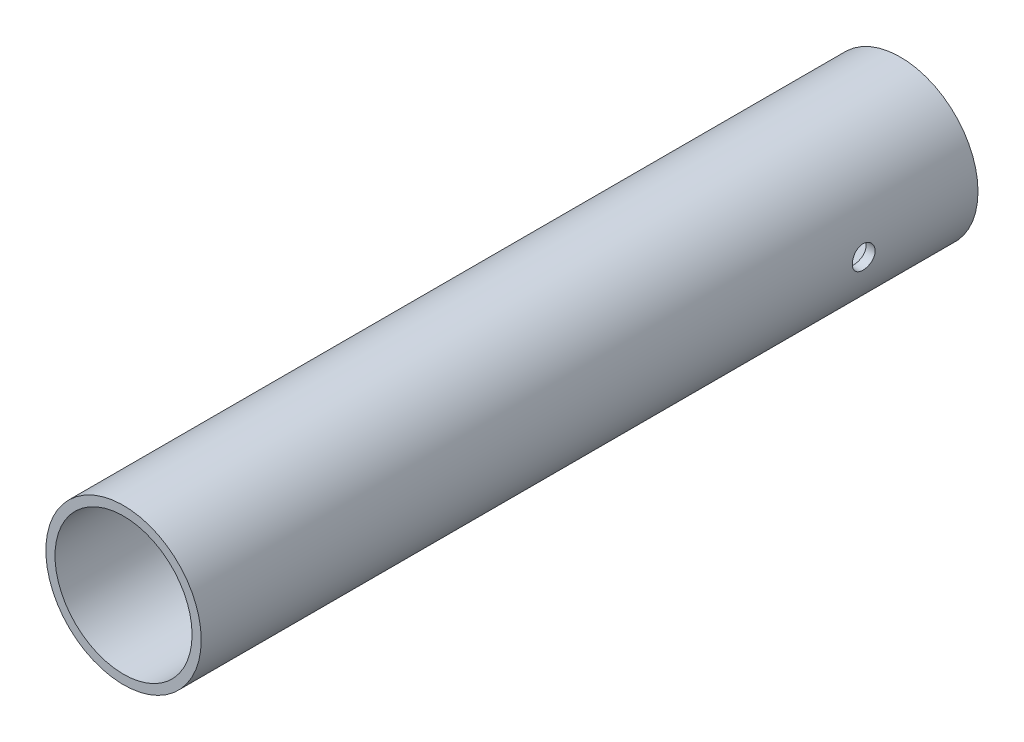
ISO-10303-21;
HEADER;
FILE_DESCRIPTION(('STEP AP214'),'2;1');
FILE_NAME('part.step','',(''),(''),'','','');
FILE_SCHEMA(('AUTOMOTIVE_DESIGN { 1 0 10303 214 1 1 1 1 }'));
ENDSEC;
DATA;
#1=APPLICATION_CONTEXT('core data for automotive mechanical design processes');
#2=APPLICATION_PROTOCOL_DEFINITION('international standard','automotive_design',2000,#1);
#3=PRODUCT_CONTEXT('',#1,'mechanical');
#4=PRODUCT('Part','Part','',(#3));
#5=PRODUCT_RELATED_PRODUCT_CATEGORY('part','',(#4));
#6=PRODUCT_DEFINITION_FORMATION('','',#4);
#7=PRODUCT_DEFINITION_CONTEXT('part definition',#1,'design');
#8=PRODUCT_DEFINITION('design','',#6,#7);
#9=PRODUCT_DEFINITION_SHAPE('','',#8);
#10=(LENGTH_UNIT() NAMED_UNIT(*) SI_UNIT(.MILLI.,.METRE.));
#11=(NAMED_UNIT(*) PLANE_ANGLE_UNIT() SI_UNIT($,.RADIAN.));
#12=(NAMED_UNIT(*) SI_UNIT($,.STERADIAN.) SOLID_ANGLE_UNIT());
#13=UNCERTAINTY_MEASURE_WITH_UNIT(LENGTH_MEASURE(1.E-05),#10,'distance_accuracy_value','');
#14=(GEOMETRIC_REPRESENTATION_CONTEXT(3) GLOBAL_UNCERTAINTY_ASSIGNED_CONTEXT((#13)) GLOBAL_UNIT_ASSIGNED_CONTEXT((#10,
#11,#12)) REPRESENTATION_CONTEXT('',''));
#15=CARTESIAN_POINT('',(0.,0.,0.));
#16=DIRECTION('',(0.,0.,1.));
#17=DIRECTION('',(1.,0.,0.));
#18=AXIS2_PLACEMENT_3D('',#15,#16,#17);
#19=CARTESIAN_POINT('',(0.,0.,85.));
#20=DIRECTION('',(0.,0.,-1.));
#21=DIRECTION('',(-1.,0.,0.));
#22=AXIS2_PLACEMENT_3D('',#19,#20,#21);
#23=CYLINDRICAL_SURFACE('',#22,15.);
#24=CARTESIAN_POINT('',(-15.,0.,-57.5));
#25=CARTESIAN_POINT('',(-14.9999976116882,-0.139390904958215,-57.5000055889478));
#26=CARTESIAN_POINT('',(-14.9980367791303,-0.278857881838822,-57.5116972749689));
#27=CARTESIAN_POINT('',(-14.9904034494139,-0.553880221673043,-57.5581356587653));
#28=CARTESIAN_POINT('',(-14.9847275392389,-0.689431867959246,-57.5929035569116));
#29=CARTESIAN_POINT('',(-14.9703006823645,-0.952604747212641,-57.6844154485928));
#30=CARTESIAN_POINT('',(-14.9615522515919,-1.0802323684319,-57.7411414656406));
#31=CARTESIAN_POINT('',(-14.9419422708207,-1.32414184197794,-57.8749122920524));
#32=CARTESIAN_POINT('',(-14.9310809625443,-1.44042498987859,-57.951954777483));
#33=CARTESIAN_POINT('',(-14.9083331745831,-1.65947261429168,-58.1249550838205));
#34=CARTESIAN_POINT('',(-14.8964387181486,-1.76211290353497,-58.2210691146361));
#35=CARTESIAN_POINT('',(-14.8730262687673,-1.94988849865992,-58.4291479684728));
#36=CARTESIAN_POINT('',(-14.8615082996267,-2.03502269939097,-58.5411137914566));
#37=CARTESIAN_POINT('',(-14.8400756575978,-2.18586712560513,-58.7785709661971));
#38=CARTESIAN_POINT('',(-14.8301712909164,-2.251454552861,-58.9041413368048));
#39=CARTESIAN_POINT('',(-14.8131978979467,-2.36055836541122,-59.1647095643006));
#40=CARTESIAN_POINT('',(-14.8061286801431,-2.40407624156561,-59.2997067836776));
#41=CARTESIAN_POINT('',(-14.7957053684276,-2.4674143777848,-59.5739802748565));
#42=CARTESIAN_POINT('',(-14.792317684857,-2.4874490291354,-59.7132057365014));
#43=CARTESIAN_POINT('',(-14.7895393893665,-2.50391672528987,-59.9930802768835));
#44=CARTESIAN_POINT('',(-14.7901484945721,-2.50035144038899,-60.1337292541673));
#45=CARTESIAN_POINT('',(-14.7952642886356,-2.46989509839615,-60.4109278612754));
#46=CARTESIAN_POINT('',(-14.7997307331892,-2.44324488188977,-60.5475048035452));
#47=CARTESIAN_POINT('',(-14.8119949521101,-2.36775314040344,-60.8142213178291));
#48=CARTESIAN_POINT('',(-14.8197928407327,-2.31891085431974,-60.9443606688885));
#49=CARTESIAN_POINT('',(-14.837884793341,-2.20017724609391,-61.1952288234409));
#50=CARTESIAN_POINT('',(-14.8481906710733,-2.13018591387971,-61.3159094060812));
#51=CARTESIAN_POINT('',(-14.8701291841501,-1.97121201755743,-61.5439044005384));
#52=CARTESIAN_POINT('',(-14.8817619265429,-1.88222792065429,-61.6512177324549));
#53=CARTESIAN_POINT('',(-14.9052202787979,-1.68648221215905,-61.8508260858073));
#54=CARTESIAN_POINT('',(-14.9170464923165,-1.57951396387313,-61.9429185185401));
#55=CARTESIAN_POINT('',(-14.9394260139672,-1.35153524898164,-62.1078777626653));
#56=CARTESIAN_POINT('',(-14.9499793138975,-1.23052469190642,-62.1807444501832));
#57=CARTESIAN_POINT('',(-14.9686389289291,-0.977705916166708,-62.3052022271363));
#58=CARTESIAN_POINT('',(-14.9767431840745,-0.845888725564658,-62.3567754193313));
#59=CARTESIAN_POINT('',(-14.9895750301266,-0.575298345602729,-62.436994215246));
#60=CARTESIAN_POINT('',(-14.9943029035047,-0.436525739179466,-62.4656417369737));
#61=CARTESIAN_POINT('',(-14.9998112984269,-0.157709901301623,-62.4989213584611));
#62=CARTESIAN_POINT('',(-15.0006375301278,-0.0177007371510112,-62.5038315718056));
#63=CARTESIAN_POINT('',(-14.9983747442117,0.261139772889886,-62.4902386555719));
#64=CARTESIAN_POINT('',(-14.9952858772412,0.399971163892037,-62.4717364268663));
#65=CARTESIAN_POINT('',(-14.985568269382,0.67165617554676,-62.4120751506645));
#66=CARTESIAN_POINT('',(-14.9789610480131,0.804540868385375,-62.3710537916099));
#67=CARTESIAN_POINT('',(-14.9629446445536,1.06154688486044,-62.2676654818005));
#68=CARTESIAN_POINT('',(-14.9535353051202,1.18566771590972,-62.2052973323647));
#69=CARTESIAN_POINT('',(-14.9328451630241,1.42283068946895,-62.0603488753032));
#70=CARTESIAN_POINT('',(-14.9215485588702,1.53576525093714,-61.9775948438327));
#71=CARTESIAN_POINT('',(-14.898384673919,1.74624358550268,-61.7944626846149));
#72=CARTESIAN_POINT('',(-14.8865173517155,1.84378623969658,-61.6940832767233));
#73=CARTESIAN_POINT('',(-14.8634017523585,2.021742779658,-61.4773024519286));
#74=CARTESIAN_POINT('',(-14.8521611613711,2.10196876111371,-61.3607458344856));
#75=CARTESIAN_POINT('',(-14.8317152977788,2.24170231029498,-61.1156470308615));
#76=CARTESIAN_POINT('',(-14.8225099606602,2.30121053476982,-60.9871052247725));
#77=CARTESIAN_POINT('',(-14.807234536977,2.39753833147315,-60.7222102671879));
#78=CARTESIAN_POINT('',(-14.8011515431106,2.43445143254794,-60.5858919049695));
#79=CARTESIAN_POINT('',(-14.7927771683526,2.48483545377827,-60.3088798707782));
#80=CARTESIAN_POINT('',(-14.7904854578272,2.49830841194616,-60.1681865802679));
#81=CARTESIAN_POINT('',(-14.7899673308401,2.50137286604735,-59.8882948340376));
#82=CARTESIAN_POINT('',(-14.7916905650565,2.49126013612518,-59.7490996214247));
#83=CARTESIAN_POINT('',(-14.7988978145373,2.44807983895684,-59.4744207519492));
#84=CARTESIAN_POINT('',(-14.8043818176121,2.41501234611247,-59.3389370830581));
#85=CARTESIAN_POINT('',(-14.8184735628172,2.3269744895949,-59.0756415627074));
#86=CARTESIAN_POINT('',(-14.8270776721967,2.27202959060044,-58.947820989944));
#87=CARTESIAN_POINT('',(-14.8464436892221,2.1418270039159,-58.7031643308052));
#88=CARTESIAN_POINT('',(-14.857205703884,2.06656830874856,-58.5863287896279));
#89=CARTESIAN_POINT('',(-14.8798345404562,1.89681888437215,-58.3654644168922));
#90=CARTESIAN_POINT('',(-14.891712955763,1.80211056359364,-58.2616039832997));
#91=CARTESIAN_POINT('',(-14.9151437236084,1.59660903138023,-58.0711483955251));
#92=CARTESIAN_POINT('',(-14.9266960002655,1.48581211291263,-57.9845572313618));
#93=CARTESIAN_POINT('',(-14.9482652964222,1.25036916964028,-57.8305517318001));
#94=CARTESIAN_POINT('',(-14.958271162531,1.12563278753282,-57.7632739606871));
#95=CARTESIAN_POINT('',(-14.9755116760178,0.866513069378979,-57.6507305153901));
#96=CARTESIAN_POINT('',(-14.9827490817748,0.732139494830007,-57.6054429189203));
#97=CARTESIAN_POINT('',(-14.9920579083296,0.497703310045398,-57.5479947258733));
#98=CARTESIAN_POINT('',(-14.9950202727336,0.399058830298446,-57.530025530384));
#99=CARTESIAN_POINT('',(-14.9989921598612,0.200289310319809,-57.5060262621553));
#100=CARTESIAN_POINT('',(-15.0000017162064,0.100164295608494,-57.4999959838627));
#101=CARTESIAN_POINT('',(-15.,0.,-57.5));
#102=B_SPLINE_CURVE_WITH_KNOTS('',3,(#24,#25,#26,#27,#28,#29,#30,#31,#32,#33,#34,#35,#36,#37,
#38,#39,#40,#41,#42,#43,#44,#45,#46,#47,#48,#49,#50,#51,#52,#53,#54,#55,#56,#57,#58,#59,#60,#61,
#62,#63,#64,#65,#66,#67,#68,#69,#70,#71,#72,#73,#74,#75,#76,#77,#78,#79,#80,#81,#82,#83,#84,#85,
#86,#87,#88,#89,#90,#91,#92,#93,#94,#95,#96,#97,#98,#99,#100,#101),.UNSPECIFIED.,.T.,.F.,(4,2,2,
2,2,2,2,2,2,2,2,2,2,2,2,2,2,2,2,2,2,2,2,2,2,2,2,2,2,2,2,2,2,2,2,2,2,2,4),(0.,0.41780658493851,
0.835997545695417,1.25384686702526,1.67164841267479,2.09302491062332,2.51442800169856,
2.9384252082384,3.36239376876181,3.78246077103422,4.20249804320885,4.61820521760408,
5.0339266502538,5.45164556632557,5.86939820680572,6.29232769911325,6.71525991635846,
7.13854688915902,7.56179844521147,7.98007883491395,8.39834313035858,8.81407807006413,
9.22983635826064,9.64926825627021,10.0687306305428,10.4925382200762,10.9163323737594,
11.3383602234177,11.7603513778661,12.177079095227,12.5938054618813,13.0100481822622,
13.4263115502933,13.8475138419339,14.2688133387897,14.693022316072,15.1168075213007,
15.4170424816401,15.7172722727696),.UNSPECIFIED.);
#103=CARTESIAN_POINT('',(-15.,0.,-57.5));
#104=VERTEX_POINT('',#103);
#105=EDGE_CURVE('E80',#104,#104,#102,.T.);
#106=ORIENTED_EDGE('',*,*,#105,.F.);
#107=EDGE_LOOP('',(#106));
#108=FACE_BOUND('',#107,.T.);
#109=CARTESIAN_POINT('',(15.,0.,-62.5));
#110=CARTESIAN_POINT('',(14.9999976116882,-0.139390904958214,-62.4999944110522));
#111=CARTESIAN_POINT('',(14.9980367791303,-0.27885788183882,-62.4883027250311));
#112=CARTESIAN_POINT('',(14.9904034494139,-0.553880221673041,-62.4418643412347));
#113=CARTESIAN_POINT('',(14.9847275392389,-0.689431867959245,-62.4070964430884));
#114=CARTESIAN_POINT('',(14.9703006823645,-0.952604747212642,-62.3155845514072));
#115=CARTESIAN_POINT('',(14.9615522515919,-1.0802323684319,-62.2588585343594));
#116=CARTESIAN_POINT('',(14.9419422708207,-1.32414184197794,-62.1250877079476));
#117=CARTESIAN_POINT('',(14.9310809625443,-1.44042498987859,-62.048045222517));
#118=CARTESIAN_POINT('',(14.9083331745831,-1.65947261429168,-61.8750449161795));
#119=CARTESIAN_POINT('',(14.8964387181486,-1.76211290353497,-61.7789308853639));
#120=CARTESIAN_POINT('',(14.8730262687673,-1.94988849865992,-61.5708520315272));
#121=CARTESIAN_POINT('',(14.8615082996267,-2.03502269939097,-61.4588862085434));
#122=CARTESIAN_POINT('',(14.8400756575978,-2.18586712560513,-61.2214290338029));
#123=CARTESIAN_POINT('',(14.8301712909164,-2.251454552861,-61.0958586631952));
#124=CARTESIAN_POINT('',(14.8131978979467,-2.36055836541122,-60.8352904356994));
#125=CARTESIAN_POINT('',(14.8061286801431,-2.40407624156561,-60.7002932163224));
#126=CARTESIAN_POINT('',(14.7957053684276,-2.4674143777848,-60.4260197251435));
#127=CARTESIAN_POINT('',(14.792317684857,-2.4874490291354,-60.2867942634986));
#128=CARTESIAN_POINT('',(14.7895393893665,-2.50391672528987,-60.0069197231165));
#129=CARTESIAN_POINT('',(14.7901484945721,-2.50035144038899,-59.8662707458327));
#130=CARTESIAN_POINT('',(14.7952642886356,-2.46989509839615,-59.5890721387245));
#131=CARTESIAN_POINT('',(14.7997307331892,-2.44324488188977,-59.4524951964548));
#132=CARTESIAN_POINT('',(14.8119949521101,-2.36775314040344,-59.1857786821709));
#133=CARTESIAN_POINT('',(14.8197928407327,-2.31891085431973,-59.0556393311115));
#134=CARTESIAN_POINT('',(14.837884793341,-2.20017724609391,-58.8047711765591));
#135=CARTESIAN_POINT('',(14.8481906710733,-2.13018591387971,-58.6840905939188));
#136=CARTESIAN_POINT('',(14.8701291841501,-1.97121201755743,-58.4560955994616));
#137=CARTESIAN_POINT('',(14.8817619265429,-1.88222792065429,-58.3487822675451));
#138=CARTESIAN_POINT('',(14.9052202787979,-1.68648221215905,-58.1491739141927));
#139=CARTESIAN_POINT('',(14.9170464923165,-1.57951396387313,-58.0570814814599));
#140=CARTESIAN_POINT('',(14.9394260139672,-1.35153524898164,-57.8921222373347));
#141=CARTESIAN_POINT('',(14.9499793138975,-1.23052469190642,-57.8192555498168));
#142=CARTESIAN_POINT('',(14.9686389289291,-0.977705916166709,-57.6947977728637));
#143=CARTESIAN_POINT('',(14.9767431840745,-0.845888725564659,-57.6432245806687));
#144=CARTESIAN_POINT('',(14.9895750301266,-0.575298345602731,-57.563005784754));
#145=CARTESIAN_POINT('',(14.9943029035047,-0.436525739179468,-57.5343582630263));
#146=CARTESIAN_POINT('',(14.9998112984269,-0.157709901301625,-57.5010786415389));
#147=CARTESIAN_POINT('',(15.0006375301278,-0.017700737151012,-57.4961684281944));
#148=CARTESIAN_POINT('',(14.9983747442117,0.261139772889886,-57.5097613444281));
#149=CARTESIAN_POINT('',(14.9952858772412,0.399971163892038,-57.5282635731337));
#150=CARTESIAN_POINT('',(14.985568269382,0.671656175546761,-57.5879248493355));
#151=CARTESIAN_POINT('',(14.9789610480131,0.804540868385376,-57.6289462083901));
#152=CARTESIAN_POINT('',(14.9629446445536,1.06154688486044,-57.7323345181995));
#153=CARTESIAN_POINT('',(14.9535353051202,1.18566771590972,-57.7947026676353));
#154=CARTESIAN_POINT('',(14.9328451630241,1.42283068946895,-57.9396511246968));
#155=CARTESIAN_POINT('',(14.9215485588702,1.53576525093714,-58.0224051561673));
#156=CARTESIAN_POINT('',(14.898384673919,1.74624358550268,-58.2055373153851));
#157=CARTESIAN_POINT('',(14.8865173517155,1.84378623969658,-58.3059167232767));
#158=CARTESIAN_POINT('',(14.8634017523585,2.021742779658,-58.5226975480714));
#159=CARTESIAN_POINT('',(14.8521611613711,2.10196876111371,-58.6392541655144));
#160=CARTESIAN_POINT('',(14.8317152977788,2.24170231029498,-58.8843529691385));
#161=CARTESIAN_POINT('',(14.8225099606602,2.30121053476982,-59.0128947752275));
#162=CARTESIAN_POINT('',(14.807234536977,2.39753833147315,-59.2777897328121));
#163=CARTESIAN_POINT('',(14.8011515431106,2.43445143254794,-59.4141080950305));
#164=CARTESIAN_POINT('',(14.7927771683526,2.48483545377827,-59.6911201292218));
#165=CARTESIAN_POINT('',(14.7904854578272,2.49830841194616,-59.8318134197321));
#166=CARTESIAN_POINT('',(14.7899673308401,2.50137286604735,-60.1117051659624));
#167=CARTESIAN_POINT('',(14.7916905650565,2.49126013612518,-60.2509003785753));
#168=CARTESIAN_POINT('',(14.7988978145373,2.44807983895684,-60.5255792480508));
#169=CARTESIAN_POINT('',(14.8043818176121,2.41501234611247,-60.6610629169419));
#170=CARTESIAN_POINT('',(14.8184735628172,2.3269744895949,-60.9243584372926));
#171=CARTESIAN_POINT('',(14.8270776721967,2.27202959060044,-61.052179010056));
#172=CARTESIAN_POINT('',(14.8464436892221,2.1418270039159,-61.2968356691948));
#173=CARTESIAN_POINT('',(14.857205703884,2.06656830874856,-61.4136712103721));
#174=CARTESIAN_POINT('',(14.8798345404562,1.89681888437215,-61.6345355831078));
#175=CARTESIAN_POINT('',(14.891712955763,1.80211056359364,-61.7383960167003));
#176=CARTESIAN_POINT('',(14.9151437236084,1.59660903138023,-61.9288516044749));
#177=CARTESIAN_POINT('',(14.9266960002655,1.48581211291263,-62.0154427686382));
#178=CARTESIAN_POINT('',(14.9482652964222,1.25036916964028,-62.1694482681999));
#179=CARTESIAN_POINT('',(14.958271162531,1.12563278753282,-62.2367260393129));
#180=CARTESIAN_POINT('',(14.9755116760178,0.866513069378978,-62.3492694846099));
#181=CARTESIAN_POINT('',(14.9827490817748,0.732139494830007,-62.3945570810797));
#182=CARTESIAN_POINT('',(14.9920579083296,0.497703310045398,-62.4520052741267));
#183=CARTESIAN_POINT('',(14.9950202727336,0.399058830298445,-62.469974469616));
#184=CARTESIAN_POINT('',(14.9989921598612,0.200289310319808,-62.4939737378447));
#185=CARTESIAN_POINT('',(15.0000017162064,0.100164295608494,-62.5000040161374));
#186=CARTESIAN_POINT('',(15.,0.,-62.5));
#187=B_SPLINE_CURVE_WITH_KNOTS('',3,(#109,#110,#111,#112,#113,#114,#115,#116,#117,#118,#119,
#120,#121,#122,#123,#124,#125,#126,#127,#128,#129,#130,#131,#132,#133,#134,#135,#136,#137,#138,
#139,#140,#141,#142,#143,#144,#145,#146,#147,#148,#149,#150,#151,#152,#153,#154,#155,#156,#157,
#158,#159,#160,#161,#162,#163,#164,#165,#166,#167,#168,#169,#170,#171,#172,#173,#174,#175,#176,
#177,#178,#179,#180,#181,#182,#183,#184,#185,#186),.UNSPECIFIED.,.T.,.F.,(4,2,2,2,2,2,2,2,2,2,2,
2,2,2,2,2,2,2,2,2,2,2,2,2,2,2,2,2,2,2,2,2,2,2,2,2,2,2,4),(0.,0.417806584938508,
0.835997545695418,1.25384686702527,1.67164841267479,2.09302491062332,2.51442800169856,
2.9384252082384,3.36239376876181,3.78246077103423,4.20249804320886,4.61820521760409,
5.0339266502538,5.45164556632557,5.86939820680572,6.29232769911325,6.71525991635846,
7.13854688915902,7.56179844521147,7.98007883491396,8.39834313035858,8.81407807006414,
9.22983635826064,9.64926825627022,10.0687306305428,10.4925382200762,10.9163323737594,
11.3383602234177,11.7603513778662,12.177079095227,12.5938054618813,13.0100481822622,
13.4263115502933,13.8475138419339,14.2688133387897,14.693022316072,15.1168075213007,
15.4170424816401,15.7172722727696),.UNSPECIFIED.);
#188=CARTESIAN_POINT('',(15.,0.,-62.5));
#189=VERTEX_POINT('',#188);
#190=EDGE_CURVE('E75',#189,#189,#187,.T.);
#191=ORIENTED_EDGE('',*,*,#190,.F.);
#192=EDGE_LOOP('',(#191));
#193=FACE_BOUND('',#192,.T.);
#194=CARTESIAN_POINT('',(0.,0.,85.));
#195=DIRECTION('',(0.,0.,1.));
#196=DIRECTION('',(1.,0.,0.));
#197=AXIS2_PLACEMENT_3D('',#194,#195,#196);
#198=CIRCLE('',#197,15.);
#199=CARTESIAN_POINT('',(15.,0.,85.));
#200=VERTEX_POINT('',#199);
#201=EDGE_CURVE('E52',#200,#200,#198,.T.);
#202=ORIENTED_EDGE('',*,*,#201,.T.);
#203=EDGE_LOOP('',(#202));
#204=FACE_BOUND('',#203,.T.);
#205=CARTESIAN_POINT('',(0.,0.,-85.));
#206=DIRECTION('',(0.,0.,1.));
#207=DIRECTION('',(1.,0.,0.));
#208=AXIS2_PLACEMENT_3D('',#205,#206,#207);
#209=CIRCLE('',#208,15.);
#210=CARTESIAN_POINT('',(15.,0.,-85.));
#211=VERTEX_POINT('',#210);
#212=EDGE_CURVE('E86',#211,#211,#209,.T.);
#213=ORIENTED_EDGE('',*,*,#212,.F.);
#214=EDGE_LOOP('',(#213));
#215=FACE_BOUND('',#214,.T.);
#216=ADVANCED_FACE('F33',(#108,#193,#204,#215),#23,.F.);
#217=CARTESIAN_POINT('',(0.,0.,85.));
#218=DIRECTION('',(0.,0.,-1.));
#219=DIRECTION('',(-1.,0.,0.));
#220=AXIS2_PLACEMENT_3D('',#217,#218,#219);
#221=CYLINDRICAL_SURFACE('',#220,17.);
#222=CARTESIAN_POINT('',(-17.,0.,-62.5));
#223=CARTESIAN_POINT('',(-16.999997793131,0.139618263933643,-62.4999942181081));
#224=CARTESIAN_POINT('',(-16.9982619631343,0.279318334742721,-62.4882645651211));
#225=CARTESIAN_POINT('',(-16.9915044414465,0.554815864347193,-62.4416664885911));
#226=CARTESIAN_POINT('',(-16.9864795210156,0.690609351356016,-62.4067753280472));
#227=CARTESIAN_POINT('',(-16.9737086836159,0.954266664820787,-62.3149174733872));
#228=CARTESIAN_POINT('',(-16.9659647952965,1.08213631987448,-62.2579672345128));
#229=CARTESIAN_POINT('',(-16.9486124241397,1.3264840365203,-62.1236475337935));
#230=CARTESIAN_POINT('',(-16.9390042079744,1.44296372374599,-62.0462809917132));
#231=CARTESIAN_POINT('',(-16.9189113868221,1.66212119979329,-61.8727046523535));
#232=CARTESIAN_POINT('',(-16.9084213236713,1.76470092382525,-61.7763716572785));
#233=CARTESIAN_POINT('',(-16.887789985922,1.95230070871523,-61.5678620163514));
#234=CARTESIAN_POINT('',(-16.8776487311065,2.03731977497712,-61.4556844737053));
#235=CARTESIAN_POINT('',(-16.8588102121396,2.18776463859896,-61.2180137363662));
#236=CARTESIAN_POINT('',(-16.8501200004422,2.25309591742831,-61.0924601042765));
#237=CARTESIAN_POINT('',(-16.8352417558288,2.36170671911328,-60.8320129732306));
#238=CARTESIAN_POINT('',(-16.8290535918791,2.40498739680278,-60.6971199638164));
#239=CARTESIAN_POINT('',(-16.819933589302,2.46796464304165,-60.4228530062869));
#240=CARTESIAN_POINT('',(-16.8169786171038,2.4878288374678,-60.2835183316785));
#241=CARTESIAN_POINT('',(-16.8145892786749,2.50392846030981,-60.003464386118));
#242=CARTESIAN_POINT('',(-16.8151547180392,2.50016519348746,-59.8627451920508));
#243=CARTESIAN_POINT('',(-16.8197211578168,2.46925378270774,-59.5850988051509));
#244=CARTESIAN_POINT('',(-16.8236947679923,2.44229207080976,-59.4481503408737));
#245=CARTESIAN_POINT('',(-16.8345870467401,2.36604083270517,-59.1807425557001));
#246=CARTESIAN_POINT('',(-16.8415057956586,2.31675069735604,-59.050283411947));
#247=CARTESIAN_POINT('',(-16.857539142223,2.19704705914093,-58.7989887816149));
#248=CARTESIAN_POINT('',(-16.8666619500121,2.12655433007143,-58.678191579542));
#249=CARTESIAN_POINT('',(-16.8860695216999,1.96650298810832,-58.4500699591038));
#250=CARTESIAN_POINT('',(-16.8963543589216,1.87694317178514,-58.3427463918144));
#251=CARTESIAN_POINT('',(-16.9170482652418,1.6802753243751,-58.1435378637112));
#252=CARTESIAN_POINT('',(-16.9274575785055,1.57300695254414,-58.0518111500901));
#253=CARTESIAN_POINT('',(-16.9471357134677,1.34451413749425,-57.887638309751));
#254=CARTESIAN_POINT('',(-16.9564045305161,1.22328963737823,-57.8151922616415));
#255=CARTESIAN_POINT('',(-16.9727664753804,0.970190436846701,-57.6916301135368));
#256=CARTESIAN_POINT('',(-16.9798583870044,0.838309834869857,-57.6405259310717));
#257=CARTESIAN_POINT('',(-16.991057196357,0.567710944898677,-57.5612342283985));
#258=CARTESIAN_POINT('',(-16.9951642879764,0.428993101669629,-57.5330452196304));
#259=CARTESIAN_POINT('',(-16.9999050818336,0.150023519282231,-57.5005937968128));
#260=CARTESIAN_POINT('',(-17.0005703732726,0.00979761097236659,-57.4961137704723));
#261=CARTESIAN_POINT('',(-16.9984385067869,-0.269403415413674,-57.5106302951339));
#262=CARTESIAN_POINT('',(-16.9956414517703,-0.40837857054114,-57.5296261483847));
#263=CARTESIAN_POINT('',(-16.9869187192332,-0.68047610442486,-57.5903742721309));
#264=CARTESIAN_POINT('',(-16.9810075822558,-0.813622595189715,-57.6320208091092));
#265=CARTESIAN_POINT('',(-16.9667174597167,-1.07104301967473,-57.7367768070214));
#266=CARTESIAN_POINT('',(-16.9583383621802,-1.19531655049811,-57.7998872418232));
#267=CARTESIAN_POINT('',(-16.9399652839742,-1.43242218615396,-57.94629211294));
#268=CARTESIAN_POINT('',(-16.9299603948874,-1.54516798121673,-58.0297249357443));
#269=CARTESIAN_POINT('',(-16.9094840590999,-1.75513489222198,-58.2142131712884));
#270=CARTESIAN_POINT('',(-16.8990125864157,-1.85235514217673,-58.3152695663831));
#271=CARTESIAN_POINT('',(-16.8786834541762,-2.02930056628108,-58.5331038420833));
#272=CARTESIAN_POINT('',(-16.8688313544641,-2.10888006584901,-58.6500006506408));
#273=CARTESIAN_POINT('',(-16.8509540599789,-2.24727323997785,-58.8956301073293));
#274=CARTESIAN_POINT('',(-16.8429288173692,-2.30608745830279,-59.0243624454214));
#275=CARTESIAN_POINT('',(-16.8296538581595,-2.40105348668988,-59.2895698311896));
#276=CARTESIAN_POINT('',(-16.8243946779348,-2.43728264767766,-59.4260166863741));
#277=CARTESIAN_POINT('',(-16.8172219020188,-2.48629673443478,-59.7031411531762));
#278=CARTESIAN_POINT('',(-16.815308085025,-2.49908321098619,-59.8438184843133));
#279=CARTESIAN_POINT('',(-16.8150507670265,-2.50081314025997,-60.1239589898984));
#280=CARTESIAN_POINT('',(-16.8166729719777,-2.4899856124276,-60.2634207727804));
#281=CARTESIAN_POINT('',(-16.8232304869987,-2.4452849279886,-60.5385173126761));
#282=CARTESIAN_POINT('',(-16.8281657925681,-2.41141180268506,-60.6741520748879));
#283=CARTESIAN_POINT('',(-16.8407816094163,-2.32166128628093,-60.9376851195551));
#284=CARTESIAN_POINT('',(-16.8484602009356,-2.265799280287,-61.065588739286));
#285=CARTESIAN_POINT('',(-16.8656998369544,-2.13367943489691,-61.3102452268788));
#286=CARTESIAN_POINT('',(-16.8752609401864,-2.05742095912403,-61.4269977466683));
#287=CARTESIAN_POINT('',(-16.8952988011725,-1.88583847980749,-61.6472024177831));
#288=CARTESIAN_POINT('',(-16.9057832085905,-1.79034469442663,-61.7505215943461));
#289=CARTESIAN_POINT('',(-16.92642201351,-1.58336095356046,-61.9397507805396));
#290=CARTESIAN_POINT('',(-16.9365763336202,-1.47186727949618,-62.0256567318852));
#291=CARTESIAN_POINT('',(-16.9554718925697,-1.23535773881122,-62.1780241917968));
#292=CARTESIAN_POINT('',(-16.9642053874589,-1.11027358494527,-62.2443806415313));
#293=CARTESIAN_POINT('',(-16.9791991247469,-0.850667584310127,-62.3550443003182));
#294=CARTESIAN_POINT('',(-16.9854619433621,-0.716155741284793,-62.3993744891167));
#295=CARTESIAN_POINT('',(-16.9933688461727,-0.484190218187675,-62.4545995293981));
#296=CARTESIAN_POINT('',(-16.9958428419025,-0.388172624228652,-62.4715988867554));
#297=CARTESIAN_POINT('',(-16.9991591791261,-0.194783283695077,-62.4943010729119));
#298=CARTESIAN_POINT('',(-17.0000015397308,-0.0974115529944626,-62.5000040340214));
#299=CARTESIAN_POINT('',(-17.,0.,-62.5));
#300=B_SPLINE_CURVE_WITH_KNOTS('',3,(#222,#223,#224,#225,#226,#227,#228,#229,#230,#231,#232,
#233,#234,#235,#236,#237,#238,#239,#240,#241,#242,#243,#244,#245,#246,#247,#248,#249,#250,#251,
#252,#253,#254,#255,#256,#257,#258,#259,#260,#261,#262,#263,#264,#265,#266,#267,#268,#269,#270,
#271,#272,#273,#274,#275,#276,#277,#278,#279,#280,#281,#282,#283,#284,#285,#286,#287,#288,#289,
#290,#291,#292,#293,#294,#295,#296,#297,#298,#299),.UNSPECIFIED.,.T.,.F.,(4,2,2,2,2,2,2,2,2,2,2,
2,2,2,2,2,2,2,2,2,2,2,2,2,2,2,2,2,2,2,2,2,2,2,2,2,2,2,4),(0.,0.418498857511902,
0.837409152330178,1.25600755579683,1.67454612732146,2.09589880308584,2.51727533677713,
2.94064374704005,3.3639899823766,3.78428694551124,4.2045606991021,4.6214881774743,
5.03842703074502,5.45694360373011,5.87548659945091,6.29805109091572,6.72061730517517,
7.14341917050652,7.56619356861205,7.98508072630456,8.40395543411029,8.82089140788562,
9.23784630155636,9.65772400348282,10.0776251172785,10.5008742387869,10.9241122761825,
11.3458926970847,11.7676452153327,12.1853255880243,12.6030053933771,13.0203934758991,
13.4377945825891,13.8590554809119,14.2804144447029,14.7039981269519,15.1271389563846,
15.4191287002785,15.7111150241882),.UNSPECIFIED.);
#301=CARTESIAN_POINT('',(-17.,0.,-62.5));
#302=VERTEX_POINT('',#301);
#303=EDGE_CURVE('E10',#302,#302,#300,.T.);
#304=ORIENTED_EDGE('',*,*,#303,.T.);
#305=EDGE_LOOP('',(#304));
#306=FACE_BOUND('',#305,.T.);
#307=CARTESIAN_POINT('',(17.,0.,-62.5));
#308=CARTESIAN_POINT('',(16.999997793131,-0.139618263933643,-62.4999942181081));
#309=CARTESIAN_POINT('',(16.9982619631343,-0.279318334742721,-62.4882645651211));
#310=CARTESIAN_POINT('',(16.9915044414465,-0.554815864347193,-62.4416664885911));
#311=CARTESIAN_POINT('',(16.9864795210156,-0.690609351356016,-62.4067753280472));
#312=CARTESIAN_POINT('',(16.9737086836159,-0.954266664820787,-62.3149174733872));
#313=CARTESIAN_POINT('',(16.9659647952965,-1.08213631987448,-62.2579672345128));
#314=CARTESIAN_POINT('',(16.9486124241397,-1.3264840365203,-62.1236475337935));
#315=CARTESIAN_POINT('',(16.9390042079744,-1.44296372374599,-62.0462809917132));
#316=CARTESIAN_POINT('',(16.9189113868221,-1.66212119979329,-61.8727046523535));
#317=CARTESIAN_POINT('',(16.9084213236713,-1.76470092382525,-61.7763716572785));
#318=CARTESIAN_POINT('',(16.887789985922,-1.95230070871523,-61.5678620163514));
#319=CARTESIAN_POINT('',(16.8776487311065,-2.03731977497712,-61.4556844737053));
#320=CARTESIAN_POINT('',(16.8588102121396,-2.18776463859896,-61.2180137363662));
#321=CARTESIAN_POINT('',(16.8501200004422,-2.25309591742831,-61.0924601042765));
#322=CARTESIAN_POINT('',(16.8352417558288,-2.36170671911328,-60.8320129732306));
#323=CARTESIAN_POINT('',(16.8290535918791,-2.40498739680278,-60.6971199638164));
#324=CARTESIAN_POINT('',(16.819933589302,-2.46796464304165,-60.4228530062869));
#325=CARTESIAN_POINT('',(16.8169786171038,-2.4878288374678,-60.2835183316785));
#326=CARTESIAN_POINT('',(16.8145892786749,-2.50392846030981,-60.003464386118));
#327=CARTESIAN_POINT('',(16.8151547180392,-2.50016519348746,-59.8627451920508));
#328=CARTESIAN_POINT('',(16.8197211578168,-2.46925378270774,-59.5850988051509));
#329=CARTESIAN_POINT('',(16.8236947679923,-2.44229207080976,-59.4481503408737));
#330=CARTESIAN_POINT('',(16.8345870467401,-2.36604083270517,-59.1807425557001));
#331=CARTESIAN_POINT('',(16.8415057956586,-2.31675069735604,-59.050283411947));
#332=CARTESIAN_POINT('',(16.857539142223,-2.19704705914093,-58.7989887816149));
#333=CARTESIAN_POINT('',(16.8666619500121,-2.12655433007143,-58.678191579542));
#334=CARTESIAN_POINT('',(16.8860695216999,-1.96650298810832,-58.4500699591038));
#335=CARTESIAN_POINT('',(16.8963543589216,-1.87694317178514,-58.3427463918144));
#336=CARTESIAN_POINT('',(16.9170482652418,-1.6802753243751,-58.1435378637112));
#337=CARTESIAN_POINT('',(16.9274575785055,-1.57300695254414,-58.0518111500901));
#338=CARTESIAN_POINT('',(16.9471357134677,-1.34451413749425,-57.887638309751));
#339=CARTESIAN_POINT('',(16.9564045305161,-1.22328963737823,-57.8151922616415));
#340=CARTESIAN_POINT('',(16.9727664753804,-0.970190436846701,-57.6916301135368));
#341=CARTESIAN_POINT('',(16.9798583870044,-0.838309834869857,-57.6405259310717));
#342=CARTESIAN_POINT('',(16.991057196357,-0.567710944898677,-57.5612342283985));
#343=CARTESIAN_POINT('',(16.9951642879764,-0.428993101669629,-57.5330452196304));
#344=CARTESIAN_POINT('',(16.9999050818336,-0.150023519282231,-57.5005937968128));
#345=CARTESIAN_POINT('',(17.0005703732726,-0.00979761097236659,-57.4961137704723));
#346=CARTESIAN_POINT('',(16.9984385067869,0.269403415413674,-57.5106302951339));
#347=CARTESIAN_POINT('',(16.9956414517703,0.40837857054114,-57.5296261483847));
#348=CARTESIAN_POINT('',(16.9869187192332,0.68047610442486,-57.5903742721309));
#349=CARTESIAN_POINT('',(16.9810075822558,0.813622595189715,-57.6320208091092));
#350=CARTESIAN_POINT('',(16.9667174597167,1.07104301967473,-57.7367768070214));
#351=CARTESIAN_POINT('',(16.9583383621802,1.19531655049811,-57.7998872418232));
#352=CARTESIAN_POINT('',(16.9399652839742,1.43242218615396,-57.94629211294));
#353=CARTESIAN_POINT('',(16.9299603948874,1.54516798121673,-58.0297249357443));
#354=CARTESIAN_POINT('',(16.9094840590999,1.75513489222198,-58.2142131712884));
#355=CARTESIAN_POINT('',(16.8990125864157,1.85235514217673,-58.3152695663831));
#356=CARTESIAN_POINT('',(16.8786834541762,2.02930056628108,-58.5331038420833));
#357=CARTESIAN_POINT('',(16.8688313544641,2.10888006584901,-58.6500006506408));
#358=CARTESIAN_POINT('',(16.8509540599789,2.24727323997785,-58.8956301073293));
#359=CARTESIAN_POINT('',(16.8429288173692,2.30608745830279,-59.0243624454214));
#360=CARTESIAN_POINT('',(16.8296538581595,2.40105348668988,-59.2895698311896));
#361=CARTESIAN_POINT('',(16.8243946779348,2.43728264767766,-59.4260166863741));
#362=CARTESIAN_POINT('',(16.8172219020188,2.48629673443478,-59.7031411531762));
#363=CARTESIAN_POINT('',(16.815308085025,2.49908321098619,-59.8438184843133));
#364=CARTESIAN_POINT('',(16.8150507670265,2.50081314025997,-60.1239589898984));
#365=CARTESIAN_POINT('',(16.8166729719777,2.4899856124276,-60.2634207727804));
#366=CARTESIAN_POINT('',(16.8232304869987,2.4452849279886,-60.5385173126761));
#367=CARTESIAN_POINT('',(16.8281657925681,2.41141180268506,-60.6741520748879));
#368=CARTESIAN_POINT('',(16.8407816094163,2.32166128628093,-60.9376851195551));
#369=CARTESIAN_POINT('',(16.8484602009356,2.265799280287,-61.065588739286));
#370=CARTESIAN_POINT('',(16.8656998369544,2.13367943489691,-61.3102452268788));
#371=CARTESIAN_POINT('',(16.8752609401864,2.05742095912403,-61.4269977466683));
#372=CARTESIAN_POINT('',(16.8952988011725,1.88583847980749,-61.6472024177831));
#373=CARTESIAN_POINT('',(16.9057832085905,1.79034469442663,-61.7505215943461));
#374=CARTESIAN_POINT('',(16.92642201351,1.58336095356046,-61.9397507805396));
#375=CARTESIAN_POINT('',(16.9365763336202,1.47186727949618,-62.0256567318852));
#376=CARTESIAN_POINT('',(16.9554718925697,1.23535773881122,-62.1780241917968));
#377=CARTESIAN_POINT('',(16.9642053874589,1.11027358494527,-62.2443806415313));
#378=CARTESIAN_POINT('',(16.9791991247469,0.850667584310127,-62.3550443003182));
#379=CARTESIAN_POINT('',(16.9854619433621,0.716155741284793,-62.3993744891167));
#380=CARTESIAN_POINT('',(16.9933688461727,0.484190218187675,-62.4545995293981));
#381=CARTESIAN_POINT('',(16.9958428419025,0.388172624228652,-62.4715988867554));
#382=CARTESIAN_POINT('',(16.9991591791261,0.194783283695077,-62.4943010729119));
#383=CARTESIAN_POINT('',(17.0000015397308,0.0974115529944626,-62.5000040340214));
#384=CARTESIAN_POINT('',(17.,0.,-62.5));
#385=B_SPLINE_CURVE_WITH_KNOTS('',3,(#307,#308,#309,#310,#311,#312,#313,#314,#315,#316,#317,
#318,#319,#320,#321,#322,#323,#324,#325,#326,#327,#328,#329,#330,#331,#332,#333,#334,#335,#336,
#337,#338,#339,#340,#341,#342,#343,#344,#345,#346,#347,#348,#349,#350,#351,#352,#353,#354,#355,
#356,#357,#358,#359,#360,#361,#362,#363,#364,#365,#366,#367,#368,#369,#370,#371,#372,#373,#374,
#375,#376,#377,#378,#379,#380,#381,#382,#383,#384),.UNSPECIFIED.,.T.,.F.,(4,2,2,2,2,2,2,2,2,2,2,
2,2,2,2,2,2,2,2,2,2,2,2,2,2,2,2,2,2,2,2,2,2,2,2,2,2,2,4),(0.,0.418498857511902,
0.837409152330178,1.25600755579683,1.67454612732146,2.09589880308584,2.51727533677713,
2.94064374704005,3.3639899823766,3.78428694551124,4.2045606991021,4.6214881774743,
5.03842703074502,5.45694360373011,5.87548659945091,6.29805109091572,6.72061730517517,
7.14341917050652,7.56619356861205,7.98508072630456,8.40395543411029,8.82089140788562,
9.23784630155636,9.65772400348282,10.0776251172785,10.5008742387869,10.9241122761825,
11.3458926970847,11.7676452153327,12.1853255880243,12.6030053933771,13.0203934758991,
13.4377945825891,13.8590554809119,14.2804144447029,14.7039981269519,15.1271389563846,
15.4191287002785,15.7111150241882),.UNSPECIFIED.);
#386=CARTESIAN_POINT('',(17.,0.,-62.5));
#387=VERTEX_POINT('',#386);
#388=EDGE_CURVE('E44',#387,#387,#385,.T.);
#389=ORIENTED_EDGE('',*,*,#388,.T.);
#390=EDGE_LOOP('',(#389));
#391=FACE_BOUND('',#390,.T.);
#392=CARTESIAN_POINT('',(0.,0.,85.));
#393=DIRECTION('',(0.,0.,1.));
#394=DIRECTION('',(1.,0.,0.));
#395=AXIS2_PLACEMENT_3D('',#392,#393,#394);
#396=CIRCLE('',#395,17.);
#397=CARTESIAN_POINT('',(17.,0.,85.));
#398=VERTEX_POINT('',#397);
#399=EDGE_CURVE('E48',#398,#398,#396,.T.);
#400=ORIENTED_EDGE('',*,*,#399,.F.);
#401=EDGE_LOOP('',(#400));
#402=FACE_BOUND('',#401,.T.);
#403=CARTESIAN_POINT('',(0.,0.,-85.));
#404=DIRECTION('',(0.,0.,1.));
#405=DIRECTION('',(1.,0.,0.));
#406=AXIS2_PLACEMENT_3D('',#403,#404,#405);
#407=CIRCLE('',#406,17.);
#408=CARTESIAN_POINT('',(17.,0.,-85.));
#409=VERTEX_POINT('',#408);
#410=EDGE_CURVE('E58',#409,#409,#407,.T.);
#411=ORIENTED_EDGE('',*,*,#410,.T.);
#412=EDGE_LOOP('',(#411));
#413=FACE_BOUND('',#412,.T.);
#414=ADVANCED_FACE('F60',(#306,#391,#402,#413),#221,.T.);
#415=CARTESIAN_POINT('',(0.,0.,85.));
#416=DIRECTION('',(0.,0.,1.));
#417=DIRECTION('',(1.,0.,0.));
#418=AXIS2_PLACEMENT_3D('',#415,#416,#417);
#419=PLANE('',#418);
#420=ORIENTED_EDGE('',*,*,#201,.F.);
#421=EDGE_LOOP('',(#420));
#422=FACE_BOUND('',#421,.T.);
#423=ORIENTED_EDGE('',*,*,#399,.T.);
#424=EDGE_LOOP('',(#423));
#425=FACE_BOUND('',#424,.T.);
#426=ADVANCED_FACE('F69',(#422,#425),#419,.T.);
#427=CARTESIAN_POINT('',(0.,0.,-85.));
#428=DIRECTION('',(0.,0.,1.));
#429=DIRECTION('',(1.,0.,0.));
#430=AXIS2_PLACEMENT_3D('',#427,#428,#429);
#431=PLANE('',#430);
#432=ORIENTED_EDGE('',*,*,#212,.T.);
#433=EDGE_LOOP('',(#432));
#434=FACE_BOUND('',#433,.T.);
#435=ORIENTED_EDGE('',*,*,#410,.F.);
#436=EDGE_LOOP('',(#435));
#437=FACE_BOUND('',#436,.T.);
#438=ADVANCED_FACE('F95',(#434,#437),#431,.F.);
#439=CARTESIAN_POINT('',(-17.,0.,-60.));
#440=DIRECTION('',(1.,0.,0.));
#441=DIRECTION('',(0.,0.,-1.));
#442=AXIS2_PLACEMENT_3D('',#439,#440,#441);
#443=CYLINDRICAL_SURFACE('',#442,2.49999999999999);
#444=ORIENTED_EDGE('',*,*,#190,.T.);
#445=EDGE_LOOP('',(#444));
#446=FACE_BOUND('',#445,.T.);
#447=ORIENTED_EDGE('',*,*,#388,.F.);
#448=EDGE_LOOP('',(#447));
#449=FACE_BOUND('',#448,.T.);
#450=ADVANCED_FACE('F67',(#446,#449),#443,.F.);
#451=ORIENTED_EDGE('',*,*,#105,.T.);
#452=EDGE_LOOP('',(#451));
#453=FACE_BOUND('',#452,.T.);
#454=ORIENTED_EDGE('',*,*,#303,.F.);
#455=EDGE_LOOP('',(#454));
#456=FACE_BOUND('',#455,.T.);
#457=ADVANCED_FACE('F63',(#453,#456),#443,.F.);
#458=CLOSED_SHELL('',(#216,#414,#426,#438,#450,#457));
#459=MANIFOLD_SOLID_BREP('B2',#458);
#460=ADVANCED_BREP_SHAPE_REPRESENTATION('',(#18,#459),#14);
#461=SHAPE_DEFINITION_REPRESENTATION(#9,#460);
ENDSEC;
END-ISO-10303-21;
